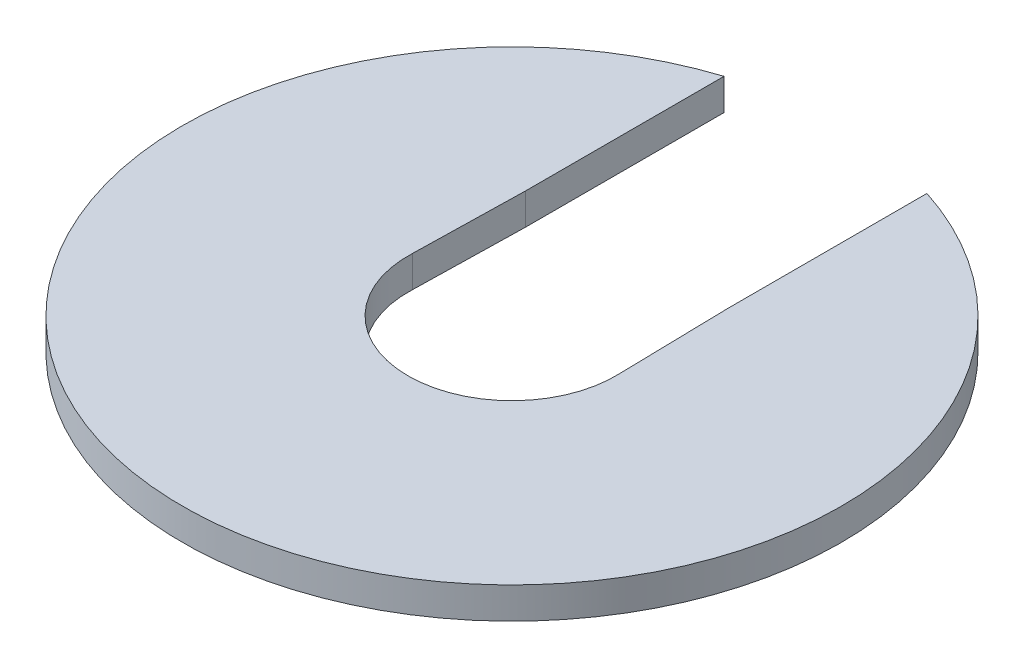
ISO-10303-21;
HEADER;
FILE_DESCRIPTION(('STEP AP214'),'2;1');
FILE_NAME('part.step','',(''),(''),'','','');
FILE_SCHEMA(('AUTOMOTIVE_DESIGN { 1 0 10303 214 1 1 1 1 }'));
ENDSEC;
DATA;
#1=APPLICATION_CONTEXT('core data for automotive mechanical design processes');
#2=APPLICATION_PROTOCOL_DEFINITION('international standard','automotive_design',2000,#1);
#3=PRODUCT_CONTEXT('',#1,'mechanical');
#4=PRODUCT('Part','Part','',(#3));
#5=PRODUCT_RELATED_PRODUCT_CATEGORY('part','',(#4));
#6=PRODUCT_DEFINITION_FORMATION('','',#4);
#7=PRODUCT_DEFINITION_CONTEXT('part definition',#1,'design');
#8=PRODUCT_DEFINITION('design','',#6,#7);
#9=PRODUCT_DEFINITION_SHAPE('','',#8);
#10=(LENGTH_UNIT() NAMED_UNIT(*) SI_UNIT(.MILLI.,.METRE.));
#11=(NAMED_UNIT(*) PLANE_ANGLE_UNIT() SI_UNIT($,.RADIAN.));
#12=(NAMED_UNIT(*) SI_UNIT($,.STERADIAN.) SOLID_ANGLE_UNIT());
#13=UNCERTAINTY_MEASURE_WITH_UNIT(LENGTH_MEASURE(1.E-05),#10,'distance_accuracy_value','');
#14=(GEOMETRIC_REPRESENTATION_CONTEXT(3) GLOBAL_UNCERTAINTY_ASSIGNED_CONTEXT((#13)) GLOBAL_UNIT_ASSIGNED_CONTEXT((#10,
#11,#12)) REPRESENTATION_CONTEXT('',''));
#15=CARTESIAN_POINT('',(0.,0.,0.));
#16=DIRECTION('',(0.,0.,1.));
#17=DIRECTION('',(1.,0.,0.));
#18=AXIS2_PLACEMENT_3D('',#15,#16,#17);
#19=CARTESIAN_POINT('',(0.,3.175,0.));
#20=DIRECTION('',(0.,-1.,0.));
#21=DIRECTION('',(0.,0.,-1.));
#22=AXIS2_PLACEMENT_3D('',#19,#20,#21);
#23=CYLINDRICAL_SURFACE('',#22,10.5);
#24=CARTESIAN_POINT('',(0.,0.,0.));
#25=DIRECTION('',(0.,1.,0.));
#26=DIRECTION('',(0.,0.,1.));
#27=AXIS2_PLACEMENT_3D('',#24,#25,#26);
#28=CIRCLE('',#27,10.5);
#29=CARTESIAN_POINT('',(-10.4902505153299,0.,-0.452376088692424));
#30=VERTEX_POINT('',#29);
#31=CARTESIAN_POINT('',(10.4902505153299,0.,-0.45237608869242));
#32=VERTEX_POINT('',#31);
#33=EDGE_CURVE('E133',#30,#32,#28,.T.);
#34=ORIENTED_EDGE('',*,*,#33,.F.);
#35=DIRECTION('',(0.,-1.,0.));
#36=VECTOR('',#35,1.);
#37=CARTESIAN_POINT('',(-10.4902505153299,3.175,-0.452376088692424));
#38=LINE('',#37,#36);
#39=CARTESIAN_POINT('',(-10.4902505153299,3.175,-0.452376088692424));
#40=VERTEX_POINT('',#39);
#41=EDGE_CURVE('E11',#40,#30,#38,.T.);
#42=ORIENTED_EDGE('',*,*,#41,.F.);
#43=CARTESIAN_POINT('',(0.,3.175,0.));
#44=DIRECTION('',(0.,1.,0.));
#45=DIRECTION('',(0.,0.,1.));
#46=AXIS2_PLACEMENT_3D('',#43,#44,#45);
#47=CIRCLE('',#46,10.5);
#48=CARTESIAN_POINT('',(10.4902505153299,3.175,-0.45237608869242));
#49=VERTEX_POINT('',#48);
#50=EDGE_CURVE('E153',#40,#49,#47,.T.);
#51=ORIENTED_EDGE('',*,*,#50,.T.);
#52=DIRECTION('',(0.,-1.,0.));
#53=VECTOR('',#52,1.);
#54=CARTESIAN_POINT('',(10.4902505153299,3.175,-0.45237608869242));
#55=LINE('',#54,#53);
#56=EDGE_CURVE('E92',#49,#32,#55,.T.);
#57=ORIENTED_EDGE('',*,*,#56,.T.);
#58=EDGE_LOOP('',(#34,#42,#51,#57));
#59=FACE_BOUND('',#58,.T.);
#60=ADVANCED_FACE('F47',(#59),#23,.F.);
#61=CARTESIAN_POINT('',(-10.495125257665,3.175,-0.226188044346231));
#62=DIRECTION('',(0.999767842464056,0.,0.0215467207427602));
#63=DIRECTION('',(0.0215467207427602,0.,-0.999767842464056));
#64=AXIS2_PLACEMENT_3D('',#61,#62,#63);
#65=PLANE('',#64);
#66=DIRECTION('',(-0.0215467207427602,0.,0.999767842464056));
#67=VECTOR('',#66,1.);
#68=CARTESIAN_POINT('',(-10.495125257665,0.,-0.226188044346231));
#69=LINE('',#68,#67);
#70=CARTESIAN_POINT('',(-10.25,0.,-11.6));
#71=VERTEX_POINT('',#70);
#72=EDGE_CURVE('E137',#71,#30,#69,.T.);
#73=ORIENTED_EDGE('',*,*,#72,.F.);
#74=DIRECTION('',(0.,-1.,0.));
#75=VECTOR('',#74,1.);
#76=CARTESIAN_POINT('',(-10.25,3.175,-11.6));
#77=LINE('',#76,#75);
#78=CARTESIAN_POINT('',(-10.25,3.175,-11.6));
#79=VERTEX_POINT('',#78);
#80=EDGE_CURVE('E56',#79,#71,#77,.T.);
#81=ORIENTED_EDGE('',*,*,#80,.F.);
#82=DIRECTION('',(-0.0215467207427602,0.,0.999767842464056));
#83=VECTOR('',#82,1.);
#84=CARTESIAN_POINT('',(-10.495125257665,3.175,-0.226188044346231));
#85=LINE('',#84,#83);
#86=EDGE_CURVE('E171',#79,#40,#85,.T.);
#87=ORIENTED_EDGE('',*,*,#86,.T.);
#88=ORIENTED_EDGE('',*,*,#41,.T.);
#89=EDGE_LOOP('',(#73,#81,#87,#88));
#90=FACE_BOUND('',#89,.T.);
#91=ADVANCED_FACE('F166',(#90),#65,.T.);
#92=CARTESIAN_POINT('',(-10.25,3.175,0.));
#93=DIRECTION('',(1.,0.,0.));
#94=DIRECTION('',(0.,0.,-1.));
#95=AXIS2_PLACEMENT_3D('',#92,#93,#94);
#96=PLANE('',#95);
#97=DIRECTION('',(0.,0.,1.));
#98=VECTOR('',#97,1.);
#99=CARTESIAN_POINT('',(-10.25,0.,0.));
#100=LINE('',#99,#98);
#101=CARTESIAN_POINT('',(-10.25,0.,-31.6832368927166));
#102=VERTEX_POINT('',#101);
#103=EDGE_CURVE('E141',#102,#71,#100,.T.);
#104=ORIENTED_EDGE('',*,*,#103,.F.);
#105=DIRECTION('',(0.,-1.,0.));
#106=VECTOR('',#105,1.);
#107=CARTESIAN_POINT('',(-10.25,3.175,-31.6832368927166));
#108=LINE('',#107,#106);
#109=CARTESIAN_POINT('',(-10.25,3.175,-31.6832368927166));
#110=VERTEX_POINT('',#109);
#111=EDGE_CURVE('E124',#110,#102,#108,.T.);
#112=ORIENTED_EDGE('',*,*,#111,.F.);
#113=DIRECTION('',(0.,0.,1.));
#114=VECTOR('',#113,1.);
#115=CARTESIAN_POINT('',(-10.25,3.175,0.));
#116=LINE('',#115,#114);
#117=EDGE_CURVE('E111',#110,#79,#116,.T.);
#118=ORIENTED_EDGE('',*,*,#117,.T.);
#119=ORIENTED_EDGE('',*,*,#80,.T.);
#120=EDGE_LOOP('',(#104,#112,#118,#119));
#121=FACE_BOUND('',#120,.T.);
#122=ADVANCED_FACE('F163',(#121),#96,.T.);
#123=CARTESIAN_POINT('',(0.,3.175,0.));
#124=DIRECTION('',(0.,-1.,0.));
#125=DIRECTION('',(0.,0.,-1.));
#126=AXIS2_PLACEMENT_3D('',#123,#124,#125);
#127=CYLINDRICAL_SURFACE('',#126,33.3);
#128=CARTESIAN_POINT('',(0.,0.,0.));
#129=DIRECTION('',(0.,1.,0.));
#130=DIRECTION('',(0.,0.,1.));
#131=AXIS2_PLACEMENT_3D('',#128,#129,#130);
#132=CIRCLE('',#131,33.3);
#133=CARTESIAN_POINT('',(10.25,0.,-31.6832368927166));
#134=VERTEX_POINT('',#133);
#135=EDGE_CURVE('E119',#102,#134,#132,.T.);
#136=ORIENTED_EDGE('',*,*,#135,.T.);
#137=DIRECTION('',(0.,-1.,0.));
#138=VECTOR('',#137,1.);
#139=CARTESIAN_POINT('',(10.25,3.175,-31.6832368927166));
#140=LINE('',#139,#138);
#141=CARTESIAN_POINT('',(10.25,3.175,-31.6832368927166));
#142=VERTEX_POINT('',#141);
#143=EDGE_CURVE('E116',#142,#134,#140,.T.);
#144=ORIENTED_EDGE('',*,*,#143,.F.);
#145=CARTESIAN_POINT('',(0.,3.175,0.));
#146=DIRECTION('',(0.,1.,0.));
#147=DIRECTION('',(0.,0.,1.));
#148=AXIS2_PLACEMENT_3D('',#145,#146,#147);
#149=CIRCLE('',#148,33.3);
#150=EDGE_CURVE('E104',#110,#142,#149,.T.);
#151=ORIENTED_EDGE('',*,*,#150,.F.);
#152=ORIENTED_EDGE('',*,*,#111,.T.);
#153=EDGE_LOOP('',(#136,#144,#151,#152));
#154=FACE_BOUND('',#153,.T.);
#155=ADVANCED_FACE('F117',(#154),#127,.T.);
#156=CARTESIAN_POINT('',(10.25,3.175,0.));
#157=DIRECTION('',(-1.,0.,0.));
#158=DIRECTION('',(0.,0.,1.));
#159=AXIS2_PLACEMENT_3D('',#156,#157,#158);
#160=PLANE('',#159);
#161=DIRECTION('',(0.,0.,-1.));
#162=VECTOR('',#161,1.);
#163=CARTESIAN_POINT('',(10.25,0.,0.));
#164=LINE('',#163,#162);
#165=CARTESIAN_POINT('',(10.25,0.,-11.6));
#166=VERTEX_POINT('',#165);
#167=EDGE_CURVE('E147',#166,#134,#164,.T.);
#168=ORIENTED_EDGE('',*,*,#167,.F.);
#169=DIRECTION('',(0.,-1.,0.));
#170=VECTOR('',#169,1.);
#171=CARTESIAN_POINT('',(10.25,3.175,-11.6));
#172=LINE('',#171,#170);
#173=CARTESIAN_POINT('',(10.25,3.175,-11.6));
#174=VERTEX_POINT('',#173);
#175=EDGE_CURVE('E85',#174,#166,#172,.T.);
#176=ORIENTED_EDGE('',*,*,#175,.F.);
#177=DIRECTION('',(0.,0.,-1.));
#178=VECTOR('',#177,1.);
#179=CARTESIAN_POINT('',(10.25,3.175,0.));
#180=LINE('',#179,#178);
#181=EDGE_CURVE('E108',#174,#142,#180,.T.);
#182=ORIENTED_EDGE('',*,*,#181,.T.);
#183=ORIENTED_EDGE('',*,*,#143,.T.);
#184=EDGE_LOOP('',(#168,#176,#182,#183));
#185=FACE_BOUND('',#184,.T.);
#186=ADVANCED_FACE('F126',(#185),#160,.T.);
#187=CARTESIAN_POINT('',(10.495125257665,3.175,-0.226188044346226));
#188=DIRECTION('',(0.999767842464056,0.,-0.0215467207427597));
#189=DIRECTION('',(-0.0215467207427597,0.,-0.999767842464056));
#190=AXIS2_PLACEMENT_3D('',#187,#188,#189);
#191=PLANE('',#190);
#192=DIRECTION('',(0.0215467207427597,0.,0.999767842464056));
#193=VECTOR('',#192,1.);
#194=CARTESIAN_POINT('',(10.495125257665,0.,-0.226188044346226));
#195=LINE('',#194,#193);
#196=EDGE_CURVE('E150',#166,#32,#195,.T.);
#197=ORIENTED_EDGE('',*,*,#196,.T.);
#198=ORIENTED_EDGE('',*,*,#56,.F.);
#199=DIRECTION('',(0.0215467207427597,0.,0.999767842464056));
#200=VECTOR('',#199,1.);
#201=CARTESIAN_POINT('',(10.495125257665,3.175,-0.226188044346226));
#202=LINE('',#201,#200);
#203=EDGE_CURVE('E64',#174,#49,#202,.T.);
#204=ORIENTED_EDGE('',*,*,#203,.F.);
#205=ORIENTED_EDGE('',*,*,#175,.T.);
#206=EDGE_LOOP('',(#197,#198,#204,#205));
#207=FACE_BOUND('',#206,.T.);
#208=ADVANCED_FACE('F169',(#207),#191,.F.);
#209=CARTESIAN_POINT('',(0.,3.175,0.));
#210=DIRECTION('',(0.,1.,0.));
#211=DIRECTION('',(0.,0.,1.));
#212=AXIS2_PLACEMENT_3D('',#209,#210,#211);
#213=PLANE('',#212);
#214=ORIENTED_EDGE('',*,*,#50,.F.);
#215=ORIENTED_EDGE('',*,*,#86,.F.);
#216=ORIENTED_EDGE('',*,*,#117,.F.);
#217=ORIENTED_EDGE('',*,*,#150,.T.);
#218=ORIENTED_EDGE('',*,*,#181,.F.);
#219=ORIENTED_EDGE('',*,*,#203,.T.);
#220=EDGE_LOOP('',(#214,#215,#216,#217,#218,#219));
#221=FACE_BOUND('',#220,.T.);
#222=ADVANCED_FACE('F106',(#221),#213,.T.);
#223=CARTESIAN_POINT('',(0.,0.,0.));
#224=DIRECTION('',(0.,1.,0.));
#225=DIRECTION('',(0.,0.,1.));
#226=AXIS2_PLACEMENT_3D('',#223,#224,#225);
#227=PLANE('',#226);
#228=ORIENTED_EDGE('',*,*,#33,.T.);
#229=ORIENTED_EDGE('',*,*,#196,.F.);
#230=ORIENTED_EDGE('',*,*,#167,.T.);
#231=ORIENTED_EDGE('',*,*,#135,.F.);
#232=ORIENTED_EDGE('',*,*,#103,.T.);
#233=ORIENTED_EDGE('',*,*,#72,.T.);
#234=EDGE_LOOP('',(#228,#229,#230,#231,#232,#233));
#235=FACE_BOUND('',#234,.T.);
#236=ADVANCED_FACE('F168',(#235),#227,.F.);
#237=CLOSED_SHELL('',(#60,#91,#122,#155,#186,#208,#222,#236));
#238=MANIFOLD_SOLID_BREP('B2',#237);
#239=ADVANCED_BREP_SHAPE_REPRESENTATION('',(#18,#238),#14);
#240=SHAPE_DEFINITION_REPRESENTATION(#9,#239);
ENDSEC;
END-ISO-10303-21;
